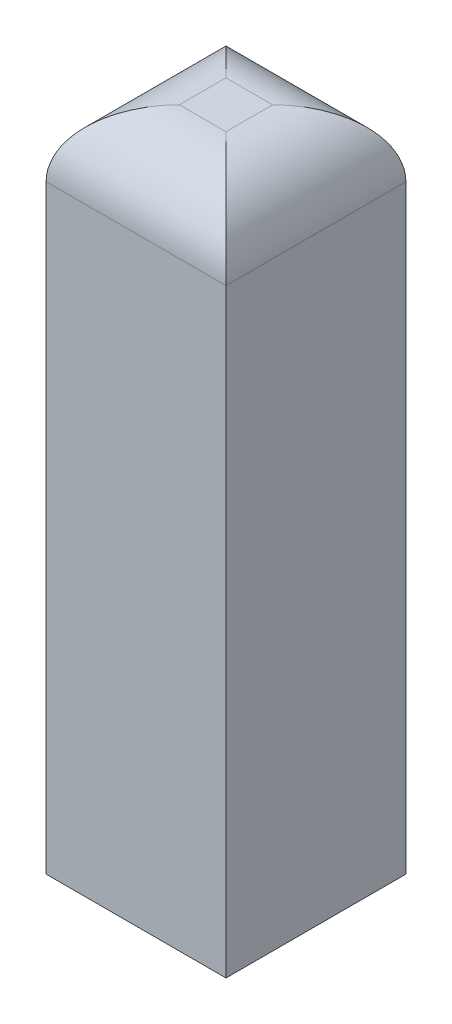
ISO-10303-21;
HEADER;
FILE_DESCRIPTION(('STEP AP214'),'2;1');
FILE_NAME('part.step','',(''),(''),'','','');
FILE_SCHEMA(('AUTOMOTIVE_DESIGN { 1 0 10303 214 1 1 1 1 }'));
ENDSEC;
DATA;
#1=APPLICATION_CONTEXT('core data for automotive mechanical design processes');
#2=APPLICATION_PROTOCOL_DEFINITION('international standard','automotive_design',2000,#1);
#3=PRODUCT_CONTEXT('',#1,'mechanical');
#4=PRODUCT('Part','Part','',(#3));
#5=PRODUCT_RELATED_PRODUCT_CATEGORY('part','',(#4));
#6=PRODUCT_DEFINITION_FORMATION('','',#4);
#7=PRODUCT_DEFINITION_CONTEXT('part definition',#1,'design');
#8=PRODUCT_DEFINITION('design','',#6,#7);
#9=PRODUCT_DEFINITION_SHAPE('','',#8);
#10=(LENGTH_UNIT() NAMED_UNIT(*) SI_UNIT(.MILLI.,.METRE.));
#11=(NAMED_UNIT(*) PLANE_ANGLE_UNIT() SI_UNIT($,.RADIAN.));
#12=(NAMED_UNIT(*) SI_UNIT($,.STERADIAN.) SOLID_ANGLE_UNIT());
#13=UNCERTAINTY_MEASURE_WITH_UNIT(LENGTH_MEASURE(1.E-05),#10,'distance_accuracy_value','');
#14=(GEOMETRIC_REPRESENTATION_CONTEXT(3) GLOBAL_UNCERTAINTY_ASSIGNED_CONTEXT((#13)) GLOBAL_UNIT_ASSIGNED_CONTEXT((#10,
#11,#12)) REPRESENTATION_CONTEXT('',''));
#15=CARTESIAN_POINT('',(0.,0.,0.));
#16=DIRECTION('',(0.,0.,1.));
#17=DIRECTION('',(1.,0.,0.));
#18=AXIS2_PLACEMENT_3D('',#15,#16,#17);
#19=CARTESIAN_POINT('',(1.35,10.,-1.35));
#20=DIRECTION('',(-1.,0.,0.));
#21=DIRECTION('',(0.,0.,1.));
#22=AXIS2_PLACEMENT_3D('',#19,#20,#21);
#23=PLANE('',#22);
#24=DIRECTION('',(0.,-1.,0.));
#25=VECTOR('',#24,1.);
#26=CARTESIAN_POINT('',(1.35,10.,-1.35));
#27=LINE('',#26,#25);
#28=CARTESIAN_POINT('',(1.35,9.,-1.35));
#29=VERTEX_POINT('',#28);
#30=CARTESIAN_POINT('',(1.35,0.,-1.35));
#31=VERTEX_POINT('',#30);
#32=EDGE_CURVE('E84',#29,#31,#27,.T.);
#33=ORIENTED_EDGE('',*,*,#32,.F.);
#34=DIRECTION('',(0.,0.,-1.));
#35=VECTOR('',#34,1.);
#36=CARTESIAN_POINT('',(1.35,9.,1.35));
#37=LINE('',#36,#35);
#38=CARTESIAN_POINT('',(1.35,9.,1.35));
#39=VERTEX_POINT('',#38);
#40=EDGE_CURVE('E11',#29,#39,#37,.F.);
#41=ORIENTED_EDGE('',*,*,#40,.T.);
#42=DIRECTION('',(0.,-1.,0.));
#43=VECTOR('',#42,1.);
#44=CARTESIAN_POINT('',(1.35,10.,1.35));
#45=LINE('',#44,#43);
#46=CARTESIAN_POINT('',(1.35,0.,1.35));
#47=VERTEX_POINT('',#46);
#48=EDGE_CURVE('E104',#39,#47,#45,.T.);
#49=ORIENTED_EDGE('',*,*,#48,.T.);
#50=DIRECTION('',(0.,0.,-1.));
#51=VECTOR('',#50,1.);
#52=CARTESIAN_POINT('',(1.35,0.,-1.35));
#53=LINE('',#52,#51);
#54=EDGE_CURVE('E99',#47,#31,#53,.T.);
#55=ORIENTED_EDGE('',*,*,#54,.T.);
#56=EDGE_LOOP('',(#33,#41,#49,#55));
#57=FACE_BOUND('',#56,.T.);
#58=ADVANCED_FACE('F32',(#57),#23,.F.);
#59=CARTESIAN_POINT('',(-1.35,10.,-1.35));
#60=DIRECTION('',(0.,0.,1.));
#61=DIRECTION('',(1.,0.,0.));
#62=AXIS2_PLACEMENT_3D('',#59,#60,#61);
#63=PLANE('',#62);
#64=DIRECTION('',(0.,-1.,0.));
#65=VECTOR('',#64,1.);
#66=CARTESIAN_POINT('',(-1.35,10.,-1.35));
#67=LINE('',#66,#65);
#68=CARTESIAN_POINT('',(-1.35,9.,-1.35));
#69=VERTEX_POINT('',#68);
#70=CARTESIAN_POINT('',(-1.35,0.,-1.35));
#71=VERTEX_POINT('',#70);
#72=EDGE_CURVE('E93',#69,#71,#67,.T.);
#73=ORIENTED_EDGE('',*,*,#72,.F.);
#74=DIRECTION('',(-1.,0.,0.));
#75=VECTOR('',#74,1.);
#76=CARTESIAN_POINT('',(1.35,9.,-1.35));
#77=LINE('',#76,#75);
#78=EDGE_CURVE('E41',#69,#29,#77,.F.);
#79=ORIENTED_EDGE('',*,*,#78,.T.);
#80=ORIENTED_EDGE('',*,*,#32,.T.);
#81=DIRECTION('',(-1.,0.,0.));
#82=VECTOR('',#81,1.);
#83=CARTESIAN_POINT('',(-1.35,0.,-1.35));
#84=LINE('',#83,#82);
#85=EDGE_CURVE('E87',#31,#71,#84,.T.);
#86=ORIENTED_EDGE('',*,*,#85,.T.);
#87=EDGE_LOOP('',(#73,#79,#80,#86));
#88=FACE_BOUND('',#87,.T.);
#89=ADVANCED_FACE('F86',(#88),#63,.F.);
#90=CARTESIAN_POINT('',(-1.35,10.,-1.35));
#91=DIRECTION('',(1.,0.,0.));
#92=DIRECTION('',(0.,0.,-1.));
#93=AXIS2_PLACEMENT_3D('',#90,#91,#92);
#94=PLANE('',#93);
#95=DIRECTION('',(0.,-1.,0.));
#96=VECTOR('',#95,1.);
#97=CARTESIAN_POINT('',(-1.35,10.,1.35));
#98=LINE('',#97,#96);
#99=CARTESIAN_POINT('',(-1.35,9.,1.35));
#100=VERTEX_POINT('',#99);
#101=CARTESIAN_POINT('',(-1.35,0.,1.35));
#102=VERTEX_POINT('',#101);
#103=EDGE_CURVE('E114',#100,#102,#98,.T.);
#104=ORIENTED_EDGE('',*,*,#103,.F.);
#105=DIRECTION('',(0.,0.,1.));
#106=VECTOR('',#105,1.);
#107=CARTESIAN_POINT('',(-1.35,9.,-1.35));
#108=LINE('',#107,#106);
#109=EDGE_CURVE('E56',#100,#69,#108,.F.);
#110=ORIENTED_EDGE('',*,*,#109,.T.);
#111=ORIENTED_EDGE('',*,*,#72,.T.);
#112=DIRECTION('',(0.,0.,1.));
#113=VECTOR('',#112,1.);
#114=CARTESIAN_POINT('',(-1.35,0.,-1.35));
#115=LINE('',#114,#113);
#116=EDGE_CURVE('E101',#71,#102,#115,.T.);
#117=ORIENTED_EDGE('',*,*,#116,.T.);
#118=EDGE_LOOP('',(#104,#110,#111,#117));
#119=FACE_BOUND('',#118,.T.);
#120=ADVANCED_FACE('F152',(#119),#94,.F.);
#121=CARTESIAN_POINT('',(-1.35,10.,1.35));
#122=DIRECTION('',(0.,0.,-1.));
#123=DIRECTION('',(-1.,0.,0.));
#124=AXIS2_PLACEMENT_3D('',#121,#122,#123);
#125=PLANE('',#124);
#126=ORIENTED_EDGE('',*,*,#48,.F.);
#127=DIRECTION('',(1.,0.,0.));
#128=VECTOR('',#127,1.);
#129=CARTESIAN_POINT('',(-1.35,9.,1.35));
#130=LINE('',#129,#128);
#131=EDGE_CURVE('E125',#39,#100,#130,.F.);
#132=ORIENTED_EDGE('',*,*,#131,.T.);
#133=ORIENTED_EDGE('',*,*,#103,.T.);
#134=DIRECTION('',(1.,0.,0.));
#135=VECTOR('',#134,1.);
#136=CARTESIAN_POINT('',(-1.35,0.,1.35));
#137=LINE('',#136,#135);
#138=EDGE_CURVE('E111',#102,#47,#137,.T.);
#139=ORIENTED_EDGE('',*,*,#138,.T.);
#140=EDGE_LOOP('',(#126,#132,#133,#139));
#141=FACE_BOUND('',#140,.T.);
#142=ADVANCED_FACE('F151',(#141),#125,.F.);
#143=CARTESIAN_POINT('',(0.,10.,0.));
#144=DIRECTION('',(0.,1.,0.));
#145=DIRECTION('',(0.,0.,1.));
#146=AXIS2_PLACEMENT_3D('',#143,#144,#145);
#147=PLANE('',#146);
#148=DIRECTION('',(0.,0.,1.));
#149=VECTOR('',#148,1.);
#150=CARTESIAN_POINT('',(-0.35,10.,1.35));
#151=LINE('',#150,#149);
#152=CARTESIAN_POINT('',(-0.35,10.,-0.35));
#153=VERTEX_POINT('',#152);
#154=CARTESIAN_POINT('',(-0.35,10.,0.35));
#155=VERTEX_POINT('',#154);
#156=EDGE_CURVE('E120',#153,#155,#151,.T.);
#157=ORIENTED_EDGE('',*,*,#156,.T.);
#158=DIRECTION('',(1.,0.,0.));
#159=VECTOR('',#158,1.);
#160=CARTESIAN_POINT('',(1.35,10.,0.35));
#161=LINE('',#160,#159);
#162=CARTESIAN_POINT('',(0.35,10.,0.35));
#163=VERTEX_POINT('',#162);
#164=EDGE_CURVE('E122',#155,#163,#161,.T.);
#165=ORIENTED_EDGE('',*,*,#164,.T.);
#166=DIRECTION('',(0.,0.,-1.));
#167=VECTOR('',#166,1.);
#168=CARTESIAN_POINT('',(0.35,10.,-1.35));
#169=LINE('',#168,#167);
#170=CARTESIAN_POINT('',(0.35,10.,-0.35));
#171=VERTEX_POINT('',#170);
#172=EDGE_CURVE('E92',#163,#171,#169,.T.);
#173=ORIENTED_EDGE('',*,*,#172,.T.);
#174=DIRECTION('',(-1.,0.,0.));
#175=VECTOR('',#174,1.);
#176=CARTESIAN_POINT('',(-1.35,10.,-0.35));
#177=LINE('',#176,#175);
#178=EDGE_CURVE('E118',#171,#153,#177,.T.);
#179=ORIENTED_EDGE('',*,*,#178,.T.);
#180=EDGE_LOOP('',(#157,#165,#173,#179));
#181=FACE_BOUND('',#180,.T.);
#182=ADVANCED_FACE('F144',(#181),#147,.T.);
#183=CARTESIAN_POINT('',(0.,0.,0.));
#184=DIRECTION('',(0.,1.,0.));
#185=DIRECTION('',(0.,0.,1.));
#186=AXIS2_PLACEMENT_3D('',#183,#184,#185);
#187=PLANE('',#186);
#188=ORIENTED_EDGE('',*,*,#54,.F.);
#189=ORIENTED_EDGE('',*,*,#138,.F.);
#190=ORIENTED_EDGE('',*,*,#116,.F.);
#191=ORIENTED_EDGE('',*,*,#85,.F.);
#192=EDGE_LOOP('',(#188,#189,#190,#191));
#193=FACE_BOUND('',#192,.T.);
#194=ADVANCED_FACE('F97',(#193),#187,.F.);
#195=CARTESIAN_POINT('',(0.,9.,-0.35));
#196=DIRECTION('',(1.,0.,0.));
#197=DIRECTION('',(0.,0.,-1.));
#198=AXIS2_PLACEMENT_3D('',#195,#196,#197);
#199=CYLINDRICAL_SURFACE('',#198,1.);
#200=CARTESIAN_POINT('',(0.35,9.,-0.35));
#201=DIRECTION('',(0.707106781186548,0.,0.707106781186547));
#202=DIRECTION('',(-0.707106781186547,0.,0.707106781186548));
#203=AXIS2_PLACEMENT_3D('',#200,#201,#202);
#204=ELLIPSE('',#203,1.41421356237309,1.);
#205=EDGE_CURVE('E108',#29,#171,#204,.T.);
#206=ORIENTED_EDGE('',*,*,#205,.F.);
#207=ORIENTED_EDGE('',*,*,#78,.F.);
#208=CARTESIAN_POINT('',(-0.35,9.,-0.35));
#209=DIRECTION('',(0.707106781186547,0.,-0.707106781186548));
#210=DIRECTION('',(0.707106781186548,0.,0.707106781186547));
#211=AXIS2_PLACEMENT_3D('',#208,#209,#210);
#212=ELLIPSE('',#211,1.4142135623731,1.);
#213=EDGE_CURVE('E36',#153,#69,#212,.F.);
#214=ORIENTED_EDGE('',*,*,#213,.F.);
#215=ORIENTED_EDGE('',*,*,#178,.F.);
#216=EDGE_LOOP('',(#206,#207,#214,#215));
#217=FACE_BOUND('',#216,.T.);
#218=ADVANCED_FACE('F34',(#217),#199,.T.);
#219=CARTESIAN_POINT('',(-0.35,9.,0.));
#220=DIRECTION('',(0.,0.,-1.));
#221=DIRECTION('',(-1.,0.,0.));
#222=AXIS2_PLACEMENT_3D('',#219,#220,#221);
#223=CYLINDRICAL_SURFACE('',#222,1.);
#224=ORIENTED_EDGE('',*,*,#213,.T.);
#225=ORIENTED_EDGE('',*,*,#109,.F.);
#226=CARTESIAN_POINT('',(-0.35,9.,0.35));
#227=DIRECTION('',(-0.707106781186548,0.,-0.707106781186547));
#228=DIRECTION('',(0.707106781186547,0.,-0.707106781186548));
#229=AXIS2_PLACEMENT_3D('',#226,#227,#228);
#230=ELLIPSE('',#229,1.41421356237309,1.);
#231=EDGE_CURVE('E132',#155,#100,#230,.F.);
#232=ORIENTED_EDGE('',*,*,#231,.F.);
#233=ORIENTED_EDGE('',*,*,#156,.F.);
#234=EDGE_LOOP('',(#224,#225,#232,#233));
#235=FACE_BOUND('',#234,.T.);
#236=ADVANCED_FACE('F169',(#235),#223,.T.);
#237=CARTESIAN_POINT('',(0.35,9.,0.));
#238=DIRECTION('',(0.,0.,1.));
#239=DIRECTION('',(1.,0.,0.));
#240=AXIS2_PLACEMENT_3D('',#237,#238,#239);
#241=CYLINDRICAL_SURFACE('',#240,1.);
#242=ORIENTED_EDGE('',*,*,#205,.T.);
#243=ORIENTED_EDGE('',*,*,#172,.F.);
#244=CARTESIAN_POINT('',(0.35,9.,0.35));
#245=DIRECTION('',(-0.707106781186547,0.,0.707106781186548));
#246=DIRECTION('',(0.707106781186548,0.,0.707106781186547));
#247=AXIS2_PLACEMENT_3D('',#244,#245,#246);
#248=ELLIPSE('',#247,1.4142135623731,1.);
#249=EDGE_CURVE('E130',#39,#163,#248,.T.);
#250=ORIENTED_EDGE('',*,*,#249,.F.);
#251=ORIENTED_EDGE('',*,*,#40,.F.);
#252=EDGE_LOOP('',(#242,#243,#250,#251));
#253=FACE_BOUND('',#252,.T.);
#254=ADVANCED_FACE('F137',(#253),#241,.T.);
#255=CARTESIAN_POINT('',(0.,9.,0.35));
#256=DIRECTION('',(-1.,0.,0.));
#257=DIRECTION('',(0.,0.,1.));
#258=AXIS2_PLACEMENT_3D('',#255,#256,#257);
#259=CYLINDRICAL_SURFACE('',#258,1.);
#260=ORIENTED_EDGE('',*,*,#231,.T.);
#261=ORIENTED_EDGE('',*,*,#131,.F.);
#262=ORIENTED_EDGE('',*,*,#249,.T.);
#263=ORIENTED_EDGE('',*,*,#164,.F.);
#264=EDGE_LOOP('',(#260,#261,#262,#263));
#265=FACE_BOUND('',#264,.T.);
#266=ADVANCED_FACE('F148',(#265),#259,.T.);
#267=CLOSED_SHELL('',(#58,#89,#120,#142,#182,#194,#218,#236,#254,#266));
#268=MANIFOLD_SOLID_BREP('B2',#267);
#269=ADVANCED_BREP_SHAPE_REPRESENTATION('',(#18,#268),#14);
#270=SHAPE_DEFINITION_REPRESENTATION(#9,#269);
ENDSEC;
END-ISO-10303-21;
